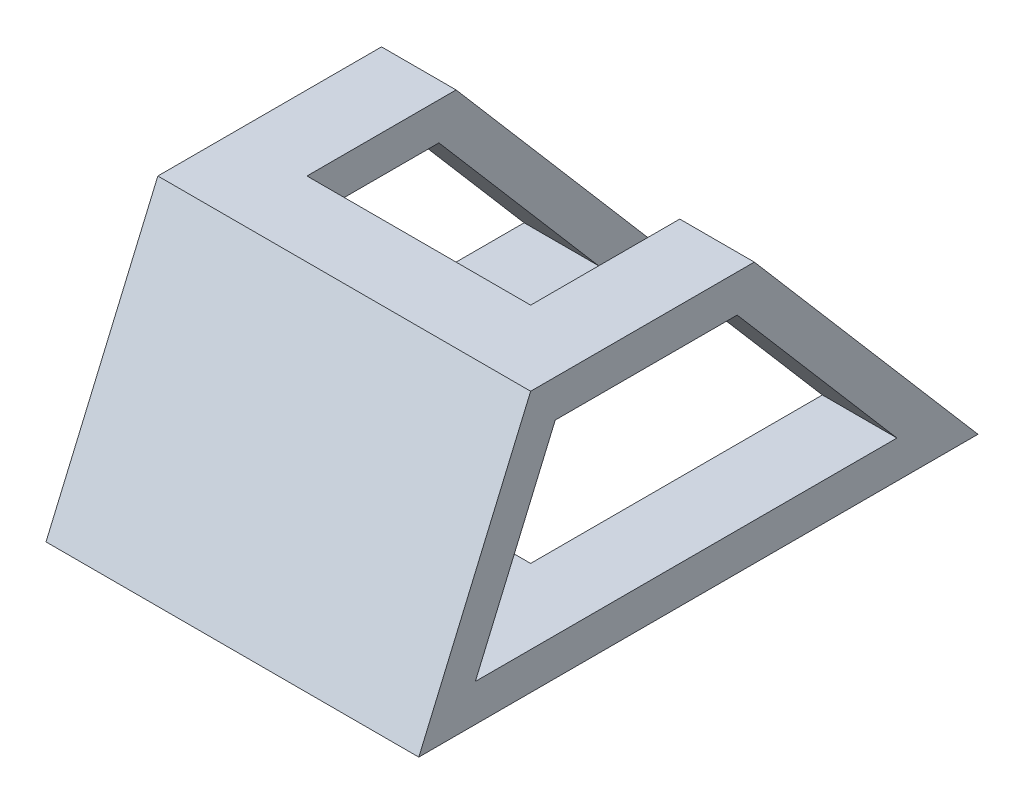
ISO-10303-21;
HEADER;
FILE_DESCRIPTION(('STEP AP214'),'2;1');
FILE_NAME('part.step','',(''),(''),'','','');
FILE_SCHEMA(('AUTOMOTIVE_DESIGN { 1 0 10303 214 1 1 1 1 }'));
ENDSEC;
DATA;
#1=APPLICATION_CONTEXT('core data for automotive mechanical design processes');
#2=APPLICATION_PROTOCOL_DEFINITION('international standard','automotive_design',2000,#1);
#3=PRODUCT_CONTEXT('',#1,'mechanical');
#4=PRODUCT('Part','Part','',(#3));
#5=PRODUCT_RELATED_PRODUCT_CATEGORY('part','',(#4));
#6=PRODUCT_DEFINITION_FORMATION('','',#4);
#7=PRODUCT_DEFINITION_CONTEXT('part definition',#1,'design');
#8=PRODUCT_DEFINITION('design','',#6,#7);
#9=PRODUCT_DEFINITION_SHAPE('','',#8);
#10=(LENGTH_UNIT() NAMED_UNIT(*) SI_UNIT(.MILLI.,.METRE.));
#11=(NAMED_UNIT(*) PLANE_ANGLE_UNIT() SI_UNIT($,.RADIAN.));
#12=(NAMED_UNIT(*) SI_UNIT($,.STERADIAN.) SOLID_ANGLE_UNIT());
#13=UNCERTAINTY_MEASURE_WITH_UNIT(LENGTH_MEASURE(1.E-05),#10,'distance_accuracy_value','');
#14=(GEOMETRIC_REPRESENTATION_CONTEXT(3) GLOBAL_UNCERTAINTY_ASSIGNED_CONTEXT((#13)) GLOBAL_UNIT_ASSIGNED_CONTEXT((#10,
#11,#12)) REPRESENTATION_CONTEXT('',''));
#15=CARTESIAN_POINT('',(0.,0.,0.));
#16=DIRECTION('',(0.,0.,1.));
#17=DIRECTION('',(1.,0.,0.));
#18=AXIS2_PLACEMENT_3D('',#15,#16,#17);
#19=CARTESIAN_POINT('',(100.,-25.3555555555556,-69.4222222222222));
#20=DIRECTION('',(0.,-0.650791373455968,0.759256602365297));
#21=DIRECTION('',(0.,-0.759256602365297,-0.650791373455968));
#22=AXIS2_PLACEMENT_3D('',#19,#20,#21);
#23=PLANE('',#22);
#24=DIRECTION('',(-1.,0.,0.));
#25=VECTOR('',#24,1.);
#26=CARTESIAN_POINT('',(100.,44.6444444444444,-9.42222222222222));
#27=LINE('',#26,#25);
#28=CARTESIAN_POINT('',(20.,44.6444444444444,-9.42222222222224));
#29=VERTEX_POINT('',#28);
#30=CARTESIAN_POINT('',(0.,44.6444444444444,-9.42222222222222));
#31=VERTEX_POINT('',#30);
#32=EDGE_CURVE('E237',#29,#31,#27,.T.);
#33=ORIENTED_EDGE('',*,*,#32,.F.);
#34=DIRECTION('',(0.,-0.759256602365297,-0.650791373455968));
#35=VECTOR('',#34,1.);
#36=CARTESIAN_POINT('',(20.,-25.3555555555556,-69.4222222222222));
#37=LINE('',#36,#35);
#38=CARTESIAN_POINT('',(20.,-25.3555555555556,-69.4222222222222));
#39=VERTEX_POINT('',#38);
#40=EDGE_CURVE('E161',#29,#39,#37,.T.);
#41=ORIENTED_EDGE('',*,*,#40,.T.);
#42=DIRECTION('',(-1.,0.,0.));
#43=VECTOR('',#42,1.);
#44=CARTESIAN_POINT('',(100.,-25.3555555555556,-69.4222222222222));
#45=LINE('',#44,#43);
#46=CARTESIAN_POINT('',(0.,-25.3555555555556,-69.4222222222222));
#47=VERTEX_POINT('',#46);
#48=EDGE_CURVE('E249',#39,#47,#45,.T.);
#49=ORIENTED_EDGE('',*,*,#48,.T.);
#50=DIRECTION('',(0.,0.759256602365297,0.650791373455968));
#51=VECTOR('',#50,1.);
#52=CARTESIAN_POINT('',(0.,-25.3555555555556,-69.4222222222222));
#53=LINE('',#52,#51);
#54=EDGE_CURVE('E231',#47,#31,#53,.T.);
#55=ORIENTED_EDGE('',*,*,#54,.T.);
#56=EDGE_LOOP('',(#33,#41,#49,#55));
#57=FACE_BOUND('',#56,.T.);
#58=ADVANCED_FACE('F33',(#57),#23,.F.);
#59=CARTESIAN_POINT('',(100.,-15.3555555555556,-47.680015854661));
#60=DIRECTION('',(0.,-0.650791373455969,0.759256602365296));
#61=DIRECTION('',(0.,-0.759256602365296,-0.650791373455969));
#62=AXIS2_PLACEMENT_3D('',#59,#60,#61);
#63=PLANE('',#62);
#64=DIRECTION('',(0.,-0.759256602365297,-0.650791373455969));
#65=VECTOR('',#64,1.);
#66=CARTESIAN_POINT('',(20.,-15.3555555555556,-47.680015854661));
#67=LINE('',#66,#65);
#68=CARTESIAN_POINT('',(20.,34.6444444444445,-4.82287299751809));
#69=VERTEX_POINT('',#68);
#70=CARTESIAN_POINT('',(20.,-15.3555555555556,-47.680015854661));
#71=VERTEX_POINT('',#70);
#72=EDGE_CURVE('E41',#69,#71,#67,.T.);
#73=ORIENTED_EDGE('',*,*,#72,.F.);
#74=DIRECTION('',(-1.,0.,0.));
#75=VECTOR('',#74,1.);
#76=CARTESIAN_POINT('',(100.,34.6444444444444,-4.8228729975181));
#77=LINE('',#76,#75);
#78=CARTESIAN_POINT('',(0.,34.6444444444444,-4.82287299751808));
#79=VERTEX_POINT('',#78);
#80=EDGE_CURVE('E203',#69,#79,#77,.T.);
#81=ORIENTED_EDGE('',*,*,#80,.T.);
#82=DIRECTION('',(0.,0.759256602365297,0.650791373455969));
#83=VECTOR('',#82,1.);
#84=CARTESIAN_POINT('',(0.,-15.3555555555556,-47.680015854661));
#85=LINE('',#84,#83);
#86=CARTESIAN_POINT('',(0.,-15.3555555555556,-47.680015854661));
#87=VERTEX_POINT('',#86);
#88=EDGE_CURVE('E196',#87,#79,#85,.T.);
#89=ORIENTED_EDGE('',*,*,#88,.F.);
#90=DIRECTION('',(-1.,0.,0.));
#91=VECTOR('',#90,1.);
#92=CARTESIAN_POINT('',(100.,-15.3555555555556,-47.680015854661));
#93=LINE('',#92,#91);
#94=EDGE_CURVE('E217',#71,#87,#93,.T.);
#95=ORIENTED_EDGE('',*,*,#94,.F.);
#96=EDGE_LOOP('',(#73,#81,#89,#95));
#97=FACE_BOUND('',#96,.T.);
#98=ADVANCED_FACE('F272',(#97),#63,.T.);
#99=CARTESIAN_POINT('',(100.,0.,0.));
#100=DIRECTION('',(1.,0.,0.));
#101=DIRECTION('',(0.,0.,-1.));
#102=AXIS2_PLACEMENT_3D('',#99,#100,#101);
#103=PLANE('',#102);
#104=DIRECTION('',(0.,0.,1.));
#105=VECTOR('',#104,1.);
#106=CARTESIAN_POINT('',(100.,44.6444444444444,-9.42222222222222));
#107=LINE('',#106,#105);
#108=CARTESIAN_POINT('',(100.,44.6444444444444,-9.42222222222222));
#109=VERTEX_POINT('',#108);
#110=CARTESIAN_POINT('',(100.,44.6444444444444,50.5777777777778));
#111=VERTEX_POINT('',#110);
#112=EDGE_CURVE('E227',#109,#111,#107,.T.);
#113=ORIENTED_EDGE('',*,*,#112,.T.);
#114=DIRECTION('',(0.,-0.919145030018058,0.393919298579168));
#115=VECTOR('',#114,1.);
#116=CARTESIAN_POINT('',(100.,44.6444444444444,50.5777777777778));
#117=LINE('',#116,#115);
#118=CARTESIAN_POINT('',(100.,-25.3555555555556,80.5777777777778));
#119=VERTEX_POINT('',#118);
#120=EDGE_CURVE('E230',#111,#119,#117,.T.);
#121=ORIENTED_EDGE('',*,*,#120,.T.);
#122=DIRECTION('',(0.,0.,-1.));
#123=VECTOR('',#122,1.);
#124=CARTESIAN_POINT('',(100.,-25.3555555555556,80.5777777777778));
#125=LINE('',#124,#123);
#126=CARTESIAN_POINT('',(100.,-25.3555555555556,-69.4222222222222));
#127=VERTEX_POINT('',#126);
#128=EDGE_CURVE('E233',#119,#127,#125,.T.);
#129=ORIENTED_EDGE('',*,*,#128,.T.);
#130=DIRECTION('',(0.,0.759256602365297,0.650791373455968));
#131=VECTOR('',#130,1.);
#132=CARTESIAN_POINT('',(100.,-25.3555555555556,-69.4222222222222));
#133=LINE('',#132,#131);
#134=EDGE_CURVE('E235',#127,#109,#133,.T.);
#135=ORIENTED_EDGE('',*,*,#134,.T.);
#136=EDGE_LOOP('',(#113,#121,#129,#135));
#137=FACE_BOUND('',#136,.T.);
#138=DIRECTION('',(0.,-0.919145030018058,0.393919298579168));
#139=VECTOR('',#138,1.);
#140=CARTESIAN_POINT('',(100.,34.6444444444444,43.9838161979722));
#141=LINE('',#140,#139);
#142=CARTESIAN_POINT('',(100.,34.6444444444444,43.9838161979722));
#143=VERTEX_POINT('',#142);
#144=CARTESIAN_POINT('',(100.,-15.3555555555556,65.4123876265436));
#145=VERTEX_POINT('',#144);
#146=EDGE_CURVE('E195',#143,#145,#141,.T.);
#147=ORIENTED_EDGE('',*,*,#146,.F.);
#148=DIRECTION('',(0.,0.,1.));
#149=VECTOR('',#148,1.);
#150=CARTESIAN_POINT('',(100.,34.6444444444444,-4.8228729975181));
#151=LINE('',#150,#149);
#152=CARTESIAN_POINT('',(100.,34.6444444444444,-4.8228729975181));
#153=VERTEX_POINT('',#152);
#154=EDGE_CURVE('E193',#153,#143,#151,.T.);
#155=ORIENTED_EDGE('',*,*,#154,.F.);
#156=DIRECTION('',(0.,0.759256602365297,0.650791373455969));
#157=VECTOR('',#156,1.);
#158=CARTESIAN_POINT('',(100.,-15.3555555555556,-47.680015854661));
#159=LINE('',#158,#157);
#160=CARTESIAN_POINT('',(100.,-15.3555555555556,-47.680015854661));
#161=VERTEX_POINT('',#160);
#162=EDGE_CURVE('E201',#161,#153,#159,.T.);
#163=ORIENTED_EDGE('',*,*,#162,.F.);
#164=DIRECTION('',(0.,0.,-1.));
#165=VECTOR('',#164,1.);
#166=CARTESIAN_POINT('',(100.,-15.3555555555556,65.4123876265436));
#167=LINE('',#166,#165);
#168=EDGE_CURVE('E198',#145,#161,#167,.T.);
#169=ORIENTED_EDGE('',*,*,#168,.F.);
#170=EDGE_LOOP('',(#147,#155,#163,#169));
#171=FACE_BOUND('',#170,.T.);
#172=ADVANCED_FACE('F282',(#137,#171),#103,.T.);
#173=CARTESIAN_POINT('',(0.,0.,0.));
#174=DIRECTION('',(1.,0.,0.));
#175=DIRECTION('',(0.,0.,-1.));
#176=AXIS2_PLACEMENT_3D('',#173,#174,#175);
#177=PLANE('',#176);
#178=DIRECTION('',(0.,0.,1.));
#179=VECTOR('',#178,1.);
#180=CARTESIAN_POINT('',(0.,44.6444444444444,-9.42222222222222));
#181=LINE('',#180,#179);
#182=CARTESIAN_POINT('',(0.,44.6444444444444,50.5777777777778));
#183=VERTEX_POINT('',#182);
#184=EDGE_CURVE('E226',#31,#183,#181,.T.);
#185=ORIENTED_EDGE('',*,*,#184,.F.);
#186=ORIENTED_EDGE('',*,*,#54,.F.);
#187=DIRECTION('',(0.,0.,-1.));
#188=VECTOR('',#187,1.);
#189=CARTESIAN_POINT('',(0.,-25.3555555555556,80.5777777777778));
#190=LINE('',#189,#188);
#191=CARTESIAN_POINT('',(0.,-25.3555555555556,80.5777777777778));
#192=VERTEX_POINT('',#191);
#193=EDGE_CURVE('E242',#192,#47,#190,.T.);
#194=ORIENTED_EDGE('',*,*,#193,.F.);
#195=DIRECTION('',(0.,-0.919145030018058,0.393919298579168));
#196=VECTOR('',#195,1.);
#197=CARTESIAN_POINT('',(0.,44.6444444444444,50.5777777777778));
#198=LINE('',#197,#196);
#199=EDGE_CURVE('E240',#183,#192,#198,.T.);
#200=ORIENTED_EDGE('',*,*,#199,.F.);
#201=EDGE_LOOP('',(#185,#186,#194,#200));
#202=FACE_BOUND('',#201,.T.);
#203=DIRECTION('',(0.,0.,1.));
#204=VECTOR('',#203,1.);
#205=CARTESIAN_POINT('',(0.,34.6444444444444,-4.8228729975181));
#206=LINE('',#205,#204);
#207=CARTESIAN_POINT('',(0.,34.6444444444444,43.9838161979722));
#208=VERTEX_POINT('',#207);
#209=EDGE_CURVE('E192',#79,#208,#206,.T.);
#210=ORIENTED_EDGE('',*,*,#209,.T.);
#211=DIRECTION('',(0.,-0.919145030018058,0.393919298579168));
#212=VECTOR('',#211,1.);
#213=CARTESIAN_POINT('',(0.,34.6444444444444,43.9838161979722));
#214=LINE('',#213,#212);
#215=CARTESIAN_POINT('',(0.,-15.3555555555556,65.4123876265436));
#216=VERTEX_POINT('',#215);
#217=EDGE_CURVE('E206',#208,#216,#214,.T.);
#218=ORIENTED_EDGE('',*,*,#217,.T.);
#219=DIRECTION('',(0.,0.,-1.));
#220=VECTOR('',#219,1.);
#221=CARTESIAN_POINT('',(0.,-15.3555555555556,65.4123876265436));
#222=LINE('',#221,#220);
#223=EDGE_CURVE('E209',#216,#87,#222,.T.);
#224=ORIENTED_EDGE('',*,*,#223,.T.);
#225=ORIENTED_EDGE('',*,*,#88,.T.);
#226=EDGE_LOOP('',(#210,#218,#224,#225));
#227=FACE_BOUND('',#226,.T.);
#228=ADVANCED_FACE('F275',(#202,#227),#177,.F.);
#229=CARTESIAN_POINT('',(100.,44.6444444444444,-9.42222222222222));
#230=DIRECTION('',(0.,-1.,0.));
#231=DIRECTION('',(0.,0.,-1.));
#232=AXIS2_PLACEMENT_3D('',#229,#230,#231);
#233=PLANE('',#232);
#234=DIRECTION('',(1.,0.,0.));
#235=VECTOR('',#234,1.);
#236=CARTESIAN_POINT('',(20.,44.6444444444444,30.5777777777778));
#237=LINE('',#236,#235);
#238=CARTESIAN_POINT('',(20.,44.6444444444444,30.5777777777778));
#239=VERTEX_POINT('',#238);
#240=CARTESIAN_POINT('',(80.,44.6444444444444,30.5777777777778));
#241=VERTEX_POINT('',#240);
#242=EDGE_CURVE('E150',#239,#241,#237,.T.);
#243=ORIENTED_EDGE('',*,*,#242,.F.);
#244=DIRECTION('',(0.,0.,1.));
#245=VECTOR('',#244,1.);
#246=CARTESIAN_POINT('',(20.,44.6444444444445,-69.4222222222222));
#247=LINE('',#246,#245);
#248=EDGE_CURVE('E158',#29,#239,#247,.T.);
#249=ORIENTED_EDGE('',*,*,#248,.F.);
#250=ORIENTED_EDGE('',*,*,#32,.T.);
#251=ORIENTED_EDGE('',*,*,#184,.T.);
#252=DIRECTION('',(-1.,0.,0.));
#253=VECTOR('',#252,1.);
#254=CARTESIAN_POINT('',(100.,44.6444444444444,50.5777777777778));
#255=LINE('',#254,#253);
#256=EDGE_CURVE('E256',#111,#183,#255,.T.);
#257=ORIENTED_EDGE('',*,*,#256,.F.);
#258=ORIENTED_EDGE('',*,*,#112,.F.);
#259=CARTESIAN_POINT('',(80.,44.6444444444444,-9.42222222222222));
#260=VERTEX_POINT('',#259);
#261=EDGE_CURVE('E247',#109,#260,#27,.T.);
#262=ORIENTED_EDGE('',*,*,#261,.T.);
#263=DIRECTION('',(0.,0.,-1.));
#264=VECTOR('',#263,1.);
#265=CARTESIAN_POINT('',(80.,44.6444444444445,-69.4222222222222));
#266=LINE('',#265,#264);
#267=EDGE_CURVE('E48',#241,#260,#266,.T.);
#268=ORIENTED_EDGE('',*,*,#267,.F.);
#269=EDGE_LOOP('',(#243,#249,#250,#251,#257,#258,#262,#268));
#270=FACE_BOUND('',#269,.T.);
#271=ADVANCED_FACE('F35',(#270),#233,.F.);
#272=CARTESIAN_POINT('',(100.,44.6444444444444,50.5777777777778));
#273=DIRECTION('',(0.,-0.393919298579168,-0.919145030018058));
#274=DIRECTION('',(0.,0.919145030018058,-0.393919298579168));
#275=AXIS2_PLACEMENT_3D('',#272,#273,#274);
#276=PLANE('',#275);
#277=ORIENTED_EDGE('',*,*,#199,.T.);
#278=DIRECTION('',(-1.,0.,0.));
#279=VECTOR('',#278,1.);
#280=CARTESIAN_POINT('',(100.,-25.3555555555556,80.5777777777778));
#281=LINE('',#280,#279);
#282=EDGE_CURVE('E253',#119,#192,#281,.T.);
#283=ORIENTED_EDGE('',*,*,#282,.F.);
#284=ORIENTED_EDGE('',*,*,#120,.F.);
#285=ORIENTED_EDGE('',*,*,#256,.T.);
#286=EDGE_LOOP('',(#277,#283,#284,#285));
#287=FACE_BOUND('',#286,.T.);
#288=ADVANCED_FACE('F319',(#287),#276,.F.);
#289=CARTESIAN_POINT('',(100.,-25.3555555555556,80.5777777777778));
#290=DIRECTION('',(0.,1.,0.));
#291=DIRECTION('',(0.,0.,1.));
#292=AXIS2_PLACEMENT_3D('',#289,#290,#291);
#293=PLANE('',#292);
#294=ORIENTED_EDGE('',*,*,#48,.F.);
#295=DIRECTION('',(0.,0.,1.));
#296=VECTOR('',#295,1.);
#297=CARTESIAN_POINT('',(20.,-25.3555555555556,80.5777777777778));
#298=LINE('',#297,#296);
#299=CARTESIAN_POINT('',(20.,-25.3555555555556,30.5777777777778));
#300=VERTEX_POINT('',#299);
#301=EDGE_CURVE('E185',#39,#300,#298,.T.);
#302=ORIENTED_EDGE('',*,*,#301,.T.);
#303=DIRECTION('',(1.,0.,0.));
#304=VECTOR('',#303,1.);
#305=CARTESIAN_POINT('',(100.,-25.3555555555556,30.5777777777778));
#306=LINE('',#305,#304);
#307=CARTESIAN_POINT('',(80.,-25.3555555555556,30.5777777777778));
#308=VERTEX_POINT('',#307);
#309=EDGE_CURVE('E189',#300,#308,#306,.T.);
#310=ORIENTED_EDGE('',*,*,#309,.T.);
#311=DIRECTION('',(0.,0.,-1.));
#312=VECTOR('',#311,1.);
#313=CARTESIAN_POINT('',(80.,-25.3555555555556,80.5777777777778));
#314=LINE('',#313,#312);
#315=CARTESIAN_POINT('',(80.,-25.3555555555556,-69.4222222222222));
#316=VERTEX_POINT('',#315);
#317=EDGE_CURVE('E177',#308,#316,#314,.T.);
#318=ORIENTED_EDGE('',*,*,#317,.T.);
#319=EDGE_CURVE('E250',#127,#316,#45,.T.);
#320=ORIENTED_EDGE('',*,*,#319,.F.);
#321=ORIENTED_EDGE('',*,*,#128,.F.);
#322=ORIENTED_EDGE('',*,*,#282,.T.);
#323=ORIENTED_EDGE('',*,*,#193,.T.);
#324=EDGE_LOOP('',(#294,#302,#310,#318,#320,#321,#322,#323));
#325=FACE_BOUND('',#324,.T.);
#326=ADVANCED_FACE('F311',(#325),#293,.F.);
#327=ORIENTED_EDGE('',*,*,#319,.T.);
#328=DIRECTION('',(0.,0.759256602365297,0.650791373455968));
#329=VECTOR('',#328,1.);
#330=CARTESIAN_POINT('',(80.,-25.3555555555556,-69.4222222222222));
#331=LINE('',#330,#329);
#332=EDGE_CURVE('E175',#316,#260,#331,.T.);
#333=ORIENTED_EDGE('',*,*,#332,.T.);
#334=ORIENTED_EDGE('',*,*,#261,.F.);
#335=ORIENTED_EDGE('',*,*,#134,.F.);
#336=EDGE_LOOP('',(#327,#333,#334,#335));
#337=FACE_BOUND('',#336,.T.);
#338=ADVANCED_FACE('F303',(#337),#23,.F.);
#339=CARTESIAN_POINT('',(100.,34.6444444444444,-4.8228729975181));
#340=DIRECTION('',(0.,-1.,0.));
#341=DIRECTION('',(0.,0.,-1.));
#342=AXIS2_PLACEMENT_3D('',#339,#340,#341);
#343=PLANE('',#342);
#344=DIRECTION('',(0.,0.,-1.));
#345=VECTOR('',#344,1.);
#346=CARTESIAN_POINT('',(20.,34.6444444444444,-4.82287299751809));
#347=LINE('',#346,#345);
#348=CARTESIAN_POINT('',(20.,34.6444444444444,30.5777777777778));
#349=VERTEX_POINT('',#348);
#350=EDGE_CURVE('E182',#349,#69,#347,.T.);
#351=ORIENTED_EDGE('',*,*,#350,.F.);
#352=DIRECTION('',(-1.,0.,0.));
#353=VECTOR('',#352,1.);
#354=CARTESIAN_POINT('',(100.,34.6444444444444,30.5777777777778));
#355=LINE('',#354,#353);
#356=CARTESIAN_POINT('',(80.,34.6444444444444,30.5777777777778));
#357=VERTEX_POINT('',#356);
#358=EDGE_CURVE('E152',#357,#349,#355,.T.);
#359=ORIENTED_EDGE('',*,*,#358,.F.);
#360=DIRECTION('',(0.,0.,1.));
#361=VECTOR('',#360,1.);
#362=CARTESIAN_POINT('',(80.,34.6444444444444,-4.8228729975181));
#363=LINE('',#362,#361);
#364=CARTESIAN_POINT('',(80.,34.6444444444445,-4.82287299751809));
#365=VERTEX_POINT('',#364);
#366=EDGE_CURVE('E173',#365,#357,#363,.T.);
#367=ORIENTED_EDGE('',*,*,#366,.F.);
#368=EDGE_CURVE('E214',#153,#365,#77,.T.);
#369=ORIENTED_EDGE('',*,*,#368,.F.);
#370=ORIENTED_EDGE('',*,*,#154,.T.);
#371=DIRECTION('',(-1.,0.,0.));
#372=VECTOR('',#371,1.);
#373=CARTESIAN_POINT('',(100.,34.6444444444444,43.9838161979722));
#374=LINE('',#373,#372);
#375=EDGE_CURVE('E223',#143,#208,#374,.T.);
#376=ORIENTED_EDGE('',*,*,#375,.T.);
#377=ORIENTED_EDGE('',*,*,#209,.F.);
#378=ORIENTED_EDGE('',*,*,#80,.F.);
#379=EDGE_LOOP('',(#351,#359,#367,#369,#370,#376,#377,#378));
#380=FACE_BOUND('',#379,.T.);
#381=ADVANCED_FACE('F289',(#380),#343,.T.);
#382=CARTESIAN_POINT('',(100.,34.6444444444444,43.9838161979722));
#383=DIRECTION('',(0.,-0.393919298579168,-0.919145030018058));
#384=DIRECTION('',(0.,0.919145030018058,-0.393919298579168));
#385=AXIS2_PLACEMENT_3D('',#382,#383,#384);
#386=PLANE('',#385);
#387=ORIENTED_EDGE('',*,*,#217,.F.);
#388=ORIENTED_EDGE('',*,*,#375,.F.);
#389=ORIENTED_EDGE('',*,*,#146,.T.);
#390=DIRECTION('',(-1.,0.,0.));
#391=VECTOR('',#390,1.);
#392=CARTESIAN_POINT('',(100.,-15.3555555555556,65.4123876265436));
#393=LINE('',#392,#391);
#394=EDGE_CURVE('E221',#145,#216,#393,.T.);
#395=ORIENTED_EDGE('',*,*,#394,.T.);
#396=EDGE_LOOP('',(#387,#388,#389,#395));
#397=FACE_BOUND('',#396,.T.);
#398=ADVANCED_FACE('F317',(#397),#386,.T.);
#399=CARTESIAN_POINT('',(100.,-15.3555555555556,65.4123876265436));
#400=DIRECTION('',(0.,1.,0.));
#401=DIRECTION('',(0.,0.,1.));
#402=AXIS2_PLACEMENT_3D('',#399,#400,#401);
#403=PLANE('',#402);
#404=DIRECTION('',(0.,0.,1.));
#405=VECTOR('',#404,1.);
#406=CARTESIAN_POINT('',(20.,-15.3555555555556,65.4123876265436));
#407=LINE('',#406,#405);
#408=CARTESIAN_POINT('',(20.,-15.3555555555556,30.5777777777778));
#409=VERTEX_POINT('',#408);
#410=EDGE_CURVE('E180',#71,#409,#407,.T.);
#411=ORIENTED_EDGE('',*,*,#410,.F.);
#412=ORIENTED_EDGE('',*,*,#94,.T.);
#413=ORIENTED_EDGE('',*,*,#223,.F.);
#414=ORIENTED_EDGE('',*,*,#394,.F.);
#415=ORIENTED_EDGE('',*,*,#168,.T.);
#416=CARTESIAN_POINT('',(80.,-15.3555555555556,-47.680015854661));
#417=VERTEX_POINT('',#416);
#418=EDGE_CURVE('E218',#161,#417,#93,.T.);
#419=ORIENTED_EDGE('',*,*,#418,.T.);
#420=DIRECTION('',(0.,0.,-1.));
#421=VECTOR('',#420,1.);
#422=CARTESIAN_POINT('',(80.,-15.3555555555556,65.4123876265436));
#423=LINE('',#422,#421);
#424=CARTESIAN_POINT('',(80.,-15.3555555555556,30.5777777777778));
#425=VERTEX_POINT('',#424);
#426=EDGE_CURVE('E55',#425,#417,#423,.T.);
#427=ORIENTED_EDGE('',*,*,#426,.F.);
#428=DIRECTION('',(1.,0.,0.));
#429=VECTOR('',#428,1.);
#430=CARTESIAN_POINT('',(100.,-15.3555555555556,30.5777777777778));
#431=LINE('',#430,#429);
#432=EDGE_CURVE('E11',#409,#425,#431,.T.);
#433=ORIENTED_EDGE('',*,*,#432,.F.);
#434=EDGE_LOOP('',(#411,#412,#413,#414,#415,#419,#427,#433));
#435=FACE_BOUND('',#434,.T.);
#436=ADVANCED_FACE('F269',(#435),#403,.T.);
#437=DIRECTION('',(0.,0.759256602365297,0.650791373455969));
#438=VECTOR('',#437,1.);
#439=CARTESIAN_POINT('',(80.,-15.3555555555556,-47.680015854661));
#440=LINE('',#439,#438);
#441=EDGE_CURVE('E259',#417,#365,#440,.T.);
#442=ORIENTED_EDGE('',*,*,#441,.F.);
#443=ORIENTED_EDGE('',*,*,#418,.F.);
#444=ORIENTED_EDGE('',*,*,#162,.T.);
#445=ORIENTED_EDGE('',*,*,#368,.T.);
#446=EDGE_LOOP('',(#442,#443,#444,#445));
#447=FACE_BOUND('',#446,.T.);
#448=ADVANCED_FACE('F286',(#447),#63,.T.);
#449=CARTESIAN_POINT('',(20.,-55.3555555555556,30.5777777777778));
#450=DIRECTION('',(0.,0.,1.));
#451=DIRECTION('',(0.,-1.,0.));
#452=AXIS2_PLACEMENT_3D('',#449,#450,#451);
#453=PLANE('',#452);
#454=DIRECTION('',(0.,1.,0.));
#455=VECTOR('',#454,1.);
#456=CARTESIAN_POINT('',(20.,-55.3555555555556,30.5777777777778));
#457=LINE('',#456,#455);
#458=EDGE_CURVE('E155',#300,#409,#457,.T.);
#459=ORIENTED_EDGE('',*,*,#458,.T.);
#460=ORIENTED_EDGE('',*,*,#432,.T.);
#461=DIRECTION('',(0.,1.,0.));
#462=VECTOR('',#461,1.);
#463=CARTESIAN_POINT('',(80.,-55.3555555555556,30.5777777777778));
#464=LINE('',#463,#462);
#465=EDGE_CURVE('E170',#308,#425,#464,.T.);
#466=ORIENTED_EDGE('',*,*,#465,.F.);
#467=ORIENTED_EDGE('',*,*,#309,.F.);
#468=EDGE_LOOP('',(#459,#460,#466,#467));
#469=FACE_BOUND('',#468,.T.);
#470=ADVANCED_FACE('F327',(#469),#453,.F.);
#471=ORIENTED_EDGE('',*,*,#358,.T.);
#472=EDGE_CURVE('E145',#349,#239,#457,.T.);
#473=ORIENTED_EDGE('',*,*,#472,.T.);
#474=ORIENTED_EDGE('',*,*,#242,.T.);
#475=EDGE_CURVE('E169',#357,#241,#464,.T.);
#476=ORIENTED_EDGE('',*,*,#475,.F.);
#477=EDGE_LOOP('',(#471,#473,#474,#476));
#478=FACE_BOUND('',#477,.T.);
#479=ADVANCED_FACE('F147',(#478),#453,.F.);
#480=CARTESIAN_POINT('',(20.,-55.3555555555556,-69.4222222222222));
#481=DIRECTION('',(-1.,0.,0.));
#482=DIRECTION('',(0.,0.,1.));
#483=AXIS2_PLACEMENT_3D('',#480,#481,#482);
#484=PLANE('',#483);
#485=ORIENTED_EDGE('',*,*,#40,.F.);
#486=ORIENTED_EDGE('',*,*,#248,.T.);
#487=ORIENTED_EDGE('',*,*,#472,.F.);
#488=ORIENTED_EDGE('',*,*,#350,.T.);
#489=ORIENTED_EDGE('',*,*,#72,.T.);
#490=ORIENTED_EDGE('',*,*,#410,.T.);
#491=ORIENTED_EDGE('',*,*,#458,.F.);
#492=ORIENTED_EDGE('',*,*,#301,.F.);
#493=EDGE_LOOP('',(#485,#486,#487,#488,#489,#490,#491,#492));
#494=FACE_BOUND('',#493,.T.);
#495=ADVANCED_FACE('F159',(#494),#484,.F.);
#496=CARTESIAN_POINT('',(80.,-55.3555555555556,-69.4222222222222));
#497=DIRECTION('',(1.,0.,0.));
#498=DIRECTION('',(0.,0.,-1.));
#499=AXIS2_PLACEMENT_3D('',#496,#497,#498);
#500=PLANE('',#499);
#501=ORIENTED_EDGE('',*,*,#465,.T.);
#502=ORIENTED_EDGE('',*,*,#426,.T.);
#503=ORIENTED_EDGE('',*,*,#441,.T.);
#504=ORIENTED_EDGE('',*,*,#366,.T.);
#505=ORIENTED_EDGE('',*,*,#475,.T.);
#506=ORIENTED_EDGE('',*,*,#267,.T.);
#507=ORIENTED_EDGE('',*,*,#332,.F.);
#508=ORIENTED_EDGE('',*,*,#317,.F.);
#509=EDGE_LOOP('',(#501,#502,#503,#504,#505,#506,#507,#508));
#510=FACE_BOUND('',#509,.T.);
#511=ADVANCED_FACE('F291',(#510),#500,.F.);
#512=CLOSED_SHELL('',(#58,#98,#172,#228,#271,#288,#326,#338,#381,#398,#436,#448,#470,#479,#495,#511));
#513=MANIFOLD_SOLID_BREP('B2',#512);
#514=ADVANCED_BREP_SHAPE_REPRESENTATION('',(#18,#513),#14);
#515=SHAPE_DEFINITION_REPRESENTATION(#9,#514);
ENDSEC;
END-ISO-10303-21;
